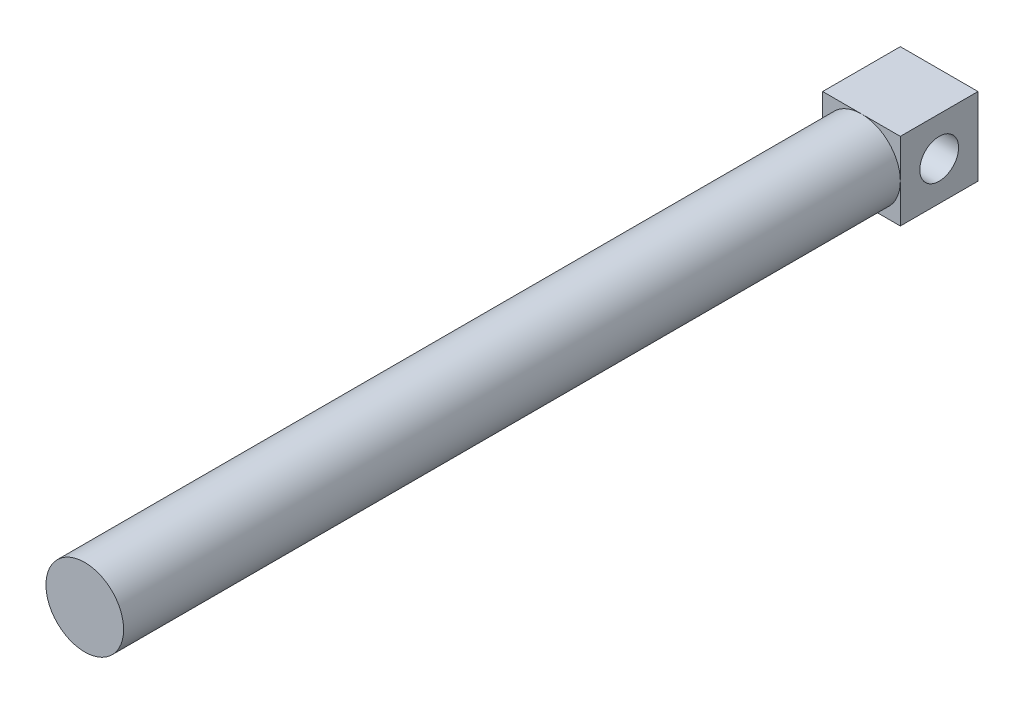
ISO-10303-21;
HEADER;
FILE_DESCRIPTION(('STEP AP214'),'2;1');
FILE_NAME('part.step','',(''),(''),'','','');
FILE_SCHEMA(('AUTOMOTIVE_DESIGN { 1 0 10303 214 1 1 1 1 }'));
ENDSEC;
DATA;
#1=APPLICATION_CONTEXT('core data for automotive mechanical design processes');
#2=APPLICATION_PROTOCOL_DEFINITION('international standard','automotive_design',2000,#1);
#3=PRODUCT_CONTEXT('',#1,'mechanical');
#4=PRODUCT('Part','Part','',(#3));
#5=PRODUCT_RELATED_PRODUCT_CATEGORY('part','',(#4));
#6=PRODUCT_DEFINITION_FORMATION('','',#4);
#7=PRODUCT_DEFINITION_CONTEXT('part definition',#1,'design');
#8=PRODUCT_DEFINITION('design','',#6,#7);
#9=PRODUCT_DEFINITION_SHAPE('','',#8);
#10=(LENGTH_UNIT() NAMED_UNIT(*) SI_UNIT(.MILLI.,.METRE.));
#11=(NAMED_UNIT(*) PLANE_ANGLE_UNIT() SI_UNIT($,.RADIAN.));
#12=(NAMED_UNIT(*) SI_UNIT($,.STERADIAN.) SOLID_ANGLE_UNIT());
#13=UNCERTAINTY_MEASURE_WITH_UNIT(LENGTH_MEASURE(1.E-05),#10,'distance_accuracy_value','');
#14=(GEOMETRIC_REPRESENTATION_CONTEXT(3) GLOBAL_UNCERTAINTY_ASSIGNED_CONTEXT((#13)) GLOBAL_UNIT_ASSIGNED_CONTEXT((#10,
#11,#12)) REPRESENTATION_CONTEXT('',''));
#15=CARTESIAN_POINT('',(0.,0.,0.));
#16=DIRECTION('',(0.,0.,1.));
#17=DIRECTION('',(1.,0.,0.));
#18=AXIS2_PLACEMENT_3D('',#15,#16,#17);
#19=CARTESIAN_POINT('',(0.,0.,100.));
#20=DIRECTION('',(0.,0.,-1.));
#21=DIRECTION('',(-1.,0.,0.));
#22=AXIS2_PLACEMENT_3D('',#19,#20,#21);
#23=CYLINDRICAL_SURFACE('',#22,5.);
#24=CARTESIAN_POINT('',(0.,0.,100.));
#25=DIRECTION('',(0.,0.,1.));
#26=DIRECTION('',(1.,0.,0.));
#27=AXIS2_PLACEMENT_3D('',#24,#25,#26);
#28=CIRCLE('',#27,5.);
#29=CARTESIAN_POINT('',(5.,0.,100.));
#30=VERTEX_POINT('',#29);
#31=EDGE_CURVE('E11',#30,#30,#28,.T.);
#32=ORIENTED_EDGE('',*,*,#31,.F.);
#33=EDGE_LOOP('',(#32));
#34=FACE_BOUND('',#33,.T.);
#35=CARTESIAN_POINT('',(0.,0.,0.));
#36=DIRECTION('',(0.,0.,1.));
#37=DIRECTION('',(1.,0.,0.));
#38=AXIS2_PLACEMENT_3D('',#35,#36,#37);
#39=CIRCLE('',#38,5.);
#40=CARTESIAN_POINT('',(5.,0.,0.));
#41=VERTEX_POINT('',#40);
#42=CARTESIAN_POINT('',(0.,5.,0.));
#43=VERTEX_POINT('',#42);
#44=EDGE_CURVE('E46',#41,#43,#39,.T.);
#45=ORIENTED_EDGE('',*,*,#44,.T.);
#46=CARTESIAN_POINT('',(-5.,0.,0.));
#47=VERTEX_POINT('',#46);
#48=EDGE_CURVE('E66',#43,#47,#39,.T.);
#49=ORIENTED_EDGE('',*,*,#48,.T.);
#50=CARTESIAN_POINT('',(0.,-5.,0.));
#51=VERTEX_POINT('',#50);
#52=EDGE_CURVE('E131',#47,#51,#39,.T.);
#53=ORIENTED_EDGE('',*,*,#52,.T.);
#54=EDGE_CURVE('E126',#51,#41,#39,.T.);
#55=ORIENTED_EDGE('',*,*,#54,.T.);
#56=EDGE_LOOP('',(#45,#49,#53,#55));
#57=FACE_BOUND('',#56,.T.);
#58=ADVANCED_FACE('F43',(#34,#57),#23,.T.);
#59=CARTESIAN_POINT('',(0.,0.,100.));
#60=DIRECTION('',(0.,0.,1.));
#61=DIRECTION('',(1.,0.,0.));
#62=AXIS2_PLACEMENT_3D('',#59,#60,#61);
#63=PLANE('',#62);
#64=ORIENTED_EDGE('',*,*,#31,.T.);
#65=EDGE_LOOP('',(#64));
#66=FACE_BOUND('',#65,.T.);
#67=ADVANCED_FACE('F190',(#66),#63,.T.);
#68=CARTESIAN_POINT('',(0.,0.,0.));
#69=DIRECTION('',(0.,0.,1.));
#70=DIRECTION('',(1.,0.,0.));
#71=AXIS2_PLACEMENT_3D('',#68,#69,#70);
#72=PLANE('',#71);
#73=ORIENTED_EDGE('',*,*,#44,.F.);
#74=DIRECTION('',(0.,-1.,0.));
#75=VECTOR('',#74,1.);
#76=CARTESIAN_POINT('',(5.,-5.,0.));
#77=LINE('',#76,#75);
#78=CARTESIAN_POINT('',(5.,5.,0.));
#79=VERTEX_POINT('',#78);
#80=EDGE_CURVE('E58',#79,#41,#77,.T.);
#81=ORIENTED_EDGE('',*,*,#80,.F.);
#82=DIRECTION('',(1.,0.,0.));
#83=VECTOR('',#82,1.);
#84=CARTESIAN_POINT('',(5.,5.,0.));
#85=LINE('',#84,#83);
#86=EDGE_CURVE('E151',#43,#79,#85,.T.);
#87=ORIENTED_EDGE('',*,*,#86,.F.);
#88=EDGE_LOOP('',(#73,#81,#87));
#89=FACE_BOUND('',#88,.T.);
#90=ADVANCED_FACE('F188',(#89),#72,.T.);
#91=ORIENTED_EDGE('',*,*,#48,.F.);
#92=CARTESIAN_POINT('',(-5.,5.,0.));
#93=VERTEX_POINT('',#92);
#94=EDGE_CURVE('E148',#93,#43,#85,.T.);
#95=ORIENTED_EDGE('',*,*,#94,.F.);
#96=DIRECTION('',(0.,1.,0.));
#97=VECTOR('',#96,1.);
#98=CARTESIAN_POINT('',(-5.,-5.,0.));
#99=LINE('',#98,#97);
#100=EDGE_CURVE('E124',#47,#93,#99,.T.);
#101=ORIENTED_EDGE('',*,*,#100,.F.);
#102=EDGE_LOOP('',(#91,#95,#101));
#103=FACE_BOUND('',#102,.T.);
#104=ADVANCED_FACE('F182',(#103),#72,.T.);
#105=ORIENTED_EDGE('',*,*,#52,.F.);
#106=CARTESIAN_POINT('',(-5.,-5.,0.));
#107=VERTEX_POINT('',#106);
#108=EDGE_CURVE('E152',#107,#47,#99,.T.);
#109=ORIENTED_EDGE('',*,*,#108,.F.);
#110=DIRECTION('',(-1.,0.,0.));
#111=VECTOR('',#110,1.);
#112=CARTESIAN_POINT('',(5.,-5.,0.));
#113=LINE('',#112,#111);
#114=EDGE_CURVE('E144',#51,#107,#113,.T.);
#115=ORIENTED_EDGE('',*,*,#114,.F.);
#116=EDGE_LOOP('',(#105,#109,#115));
#117=FACE_BOUND('',#116,.T.);
#118=ADVANCED_FACE('F179',(#117),#72,.T.);
#119=ORIENTED_EDGE('',*,*,#54,.F.);
#120=CARTESIAN_POINT('',(5.,-5.,0.));
#121=VERTEX_POINT('',#120);
#122=EDGE_CURVE('E120',#121,#51,#113,.T.);
#123=ORIENTED_EDGE('',*,*,#122,.F.);
#124=EDGE_CURVE('E147',#41,#121,#77,.T.);
#125=ORIENTED_EDGE('',*,*,#124,.F.);
#126=EDGE_LOOP('',(#119,#123,#125));
#127=FACE_BOUND('',#126,.T.);
#128=ADVANCED_FACE('F192',(#127),#72,.T.);
#129=CARTESIAN_POINT('',(-5.,-5.,-10.));
#130=DIRECTION('',(1.,0.,0.));
#131=DIRECTION('',(0.,0.,-1.));
#132=AXIS2_PLACEMENT_3D('',#129,#130,#131);
#133=PLANE('',#132);
#134=CARTESIAN_POINT('',(-5.,0.,-5.));
#135=DIRECTION('',(1.,0.,0.));
#136=DIRECTION('',(0.,0.,-1.));
#137=AXIS2_PLACEMENT_3D('',#134,#135,#136);
#138=CIRCLE('',#137,2.5);
#139=CARTESIAN_POINT('',(-5.,0.,-7.5));
#140=VERTEX_POINT('',#139);
#141=EDGE_CURVE('E163',#140,#140,#138,.T.);
#142=ORIENTED_EDGE('',*,*,#141,.T.);
#143=EDGE_LOOP('',(#142));
#144=FACE_BOUND('',#143,.T.);
#145=ORIENTED_EDGE('',*,*,#108,.T.);
#146=ORIENTED_EDGE('',*,*,#100,.T.);
#147=DIRECTION('',(0.,0.,1.));
#148=VECTOR('',#147,1.);
#149=CARTESIAN_POINT('',(-5.,5.,-10.));
#150=LINE('',#149,#148);
#151=CARTESIAN_POINT('',(-5.,5.,-10.));
#152=VERTEX_POINT('',#151);
#153=EDGE_CURVE('E104',#152,#93,#150,.T.);
#154=ORIENTED_EDGE('',*,*,#153,.F.);
#155=DIRECTION('',(0.,1.,0.));
#156=VECTOR('',#155,1.);
#157=CARTESIAN_POINT('',(-5.,-5.,-10.));
#158=LINE('',#157,#156);
#159=CARTESIAN_POINT('',(-5.,-5.,-10.));
#160=VERTEX_POINT('',#159);
#161=EDGE_CURVE('E110',#160,#152,#158,.T.);
#162=ORIENTED_EDGE('',*,*,#161,.F.);
#163=DIRECTION('',(0.,0.,1.));
#164=VECTOR('',#163,1.);
#165=CARTESIAN_POINT('',(-5.,-5.,-10.));
#166=LINE('',#165,#164);
#167=EDGE_CURVE('E138',#160,#107,#166,.T.);
#168=ORIENTED_EDGE('',*,*,#167,.T.);
#169=EDGE_LOOP('',(#145,#146,#154,#162,#168));
#170=FACE_BOUND('',#169,.T.);
#171=ADVANCED_FACE('F123',(#144,#170),#133,.F.);
#172=CARTESIAN_POINT('',(5.,5.,-10.));
#173=DIRECTION('',(0.,-1.,0.));
#174=DIRECTION('',(0.,0.,-1.));
#175=AXIS2_PLACEMENT_3D('',#172,#173,#174);
#176=PLANE('',#175);
#177=ORIENTED_EDGE('',*,*,#94,.T.);
#178=ORIENTED_EDGE('',*,*,#86,.T.);
#179=DIRECTION('',(0.,0.,1.));
#180=VECTOR('',#179,1.);
#181=CARTESIAN_POINT('',(5.,5.,-10.));
#182=LINE('',#181,#180);
#183=CARTESIAN_POINT('',(5.,5.,-10.));
#184=VERTEX_POINT('',#183);
#185=EDGE_CURVE('E105',#184,#79,#182,.T.);
#186=ORIENTED_EDGE('',*,*,#185,.F.);
#187=DIRECTION('',(1.,0.,0.));
#188=VECTOR('',#187,1.);
#189=CARTESIAN_POINT('',(5.,5.,-10.));
#190=LINE('',#189,#188);
#191=EDGE_CURVE('E99',#152,#184,#190,.T.);
#192=ORIENTED_EDGE('',*,*,#191,.F.);
#193=ORIENTED_EDGE('',*,*,#153,.T.);
#194=EDGE_LOOP('',(#177,#178,#186,#192,#193));
#195=FACE_BOUND('',#194,.T.);
#196=ADVANCED_FACE('F102',(#195),#176,.F.);
#197=CARTESIAN_POINT('',(5.,-5.,-10.));
#198=DIRECTION('',(-1.,0.,0.));
#199=DIRECTION('',(0.,0.,1.));
#200=AXIS2_PLACEMENT_3D('',#197,#198,#199);
#201=PLANE('',#200);
#202=CARTESIAN_POINT('',(5.,0.,-5.));
#203=DIRECTION('',(1.,0.,0.));
#204=DIRECTION('',(0.,0.,-1.));
#205=AXIS2_PLACEMENT_3D('',#202,#203,#204);
#206=CIRCLE('',#205,2.5);
#207=CARTESIAN_POINT('',(5.,0.,-7.5));
#208=VERTEX_POINT('',#207);
#209=EDGE_CURVE('E159',#208,#208,#206,.T.);
#210=ORIENTED_EDGE('',*,*,#209,.F.);
#211=EDGE_LOOP('',(#210));
#212=FACE_BOUND('',#211,.T.);
#213=ORIENTED_EDGE('',*,*,#80,.T.);
#214=ORIENTED_EDGE('',*,*,#124,.T.);
#215=DIRECTION('',(0.,0.,1.));
#216=VECTOR('',#215,1.);
#217=CARTESIAN_POINT('',(5.,-5.,-10.));
#218=LINE('',#217,#216);
#219=CARTESIAN_POINT('',(5.,-5.,-10.));
#220=VERTEX_POINT('',#219);
#221=EDGE_CURVE('E132',#220,#121,#218,.T.);
#222=ORIENTED_EDGE('',*,*,#221,.F.);
#223=DIRECTION('',(0.,-1.,0.));
#224=VECTOR('',#223,1.);
#225=CARTESIAN_POINT('',(5.,-5.,-10.));
#226=LINE('',#225,#224);
#227=EDGE_CURVE('E109',#184,#220,#226,.T.);
#228=ORIENTED_EDGE('',*,*,#227,.F.);
#229=ORIENTED_EDGE('',*,*,#185,.T.);
#230=EDGE_LOOP('',(#213,#214,#222,#228,#229));
#231=FACE_BOUND('',#230,.T.);
#232=ADVANCED_FACE('F266',(#212,#231),#201,.F.);
#233=CARTESIAN_POINT('',(5.,-5.,-10.));
#234=DIRECTION('',(0.,1.,0.));
#235=DIRECTION('',(0.,0.,1.));
#236=AXIS2_PLACEMENT_3D('',#233,#234,#235);
#237=PLANE('',#236);
#238=ORIENTED_EDGE('',*,*,#122,.T.);
#239=ORIENTED_EDGE('',*,*,#114,.T.);
#240=ORIENTED_EDGE('',*,*,#167,.F.);
#241=DIRECTION('',(-1.,0.,0.));
#242=VECTOR('',#241,1.);
#243=CARTESIAN_POINT('',(5.,-5.,-10.));
#244=LINE('',#243,#242);
#245=EDGE_CURVE('E115',#220,#160,#244,.T.);
#246=ORIENTED_EDGE('',*,*,#245,.F.);
#247=ORIENTED_EDGE('',*,*,#221,.T.);
#248=EDGE_LOOP('',(#238,#239,#240,#246,#247));
#249=FACE_BOUND('',#248,.T.);
#250=ADVANCED_FACE('F174',(#249),#237,.F.);
#251=CARTESIAN_POINT('',(0.,0.,-10.));
#252=DIRECTION('',(0.,0.,1.));
#253=DIRECTION('',(1.,0.,0.));
#254=AXIS2_PLACEMENT_3D('',#251,#252,#253);
#255=PLANE('',#254);
#256=ORIENTED_EDGE('',*,*,#161,.T.);
#257=ORIENTED_EDGE('',*,*,#191,.T.);
#258=ORIENTED_EDGE('',*,*,#227,.T.);
#259=ORIENTED_EDGE('',*,*,#245,.T.);
#260=EDGE_LOOP('',(#256,#257,#258,#259));
#261=FACE_BOUND('',#260,.T.);
#262=ADVANCED_FACE('F113',(#261),#255,.F.);
#263=CARTESIAN_POINT('',(-5.,0.,-5.));
#264=DIRECTION('',(1.,0.,0.));
#265=DIRECTION('',(0.,0.,-1.));
#266=AXIS2_PLACEMENT_3D('',#263,#264,#265);
#267=CYLINDRICAL_SURFACE('',#266,2.5);
#268=ORIENTED_EDGE('',*,*,#141,.F.);
#269=EDGE_LOOP('',(#268));
#270=FACE_BOUND('',#269,.T.);
#271=ORIENTED_EDGE('',*,*,#209,.T.);
#272=EDGE_LOOP('',(#271));
#273=FACE_BOUND('',#272,.T.);
#274=ADVANCED_FACE('F293',(#270,#273),#267,.F.);
#275=CLOSED_SHELL('',(#58,#67,#90,#104,#118,#128,#171,#196,#232,#250,#262,#274));
#276=MANIFOLD_SOLID_BREP('B2',#275);
#277=ADVANCED_BREP_SHAPE_REPRESENTATION('',(#18,#276),#14);
#278=SHAPE_DEFINITION_REPRESENTATION(#9,#277);
ENDSEC;
END-ISO-10303-21;
